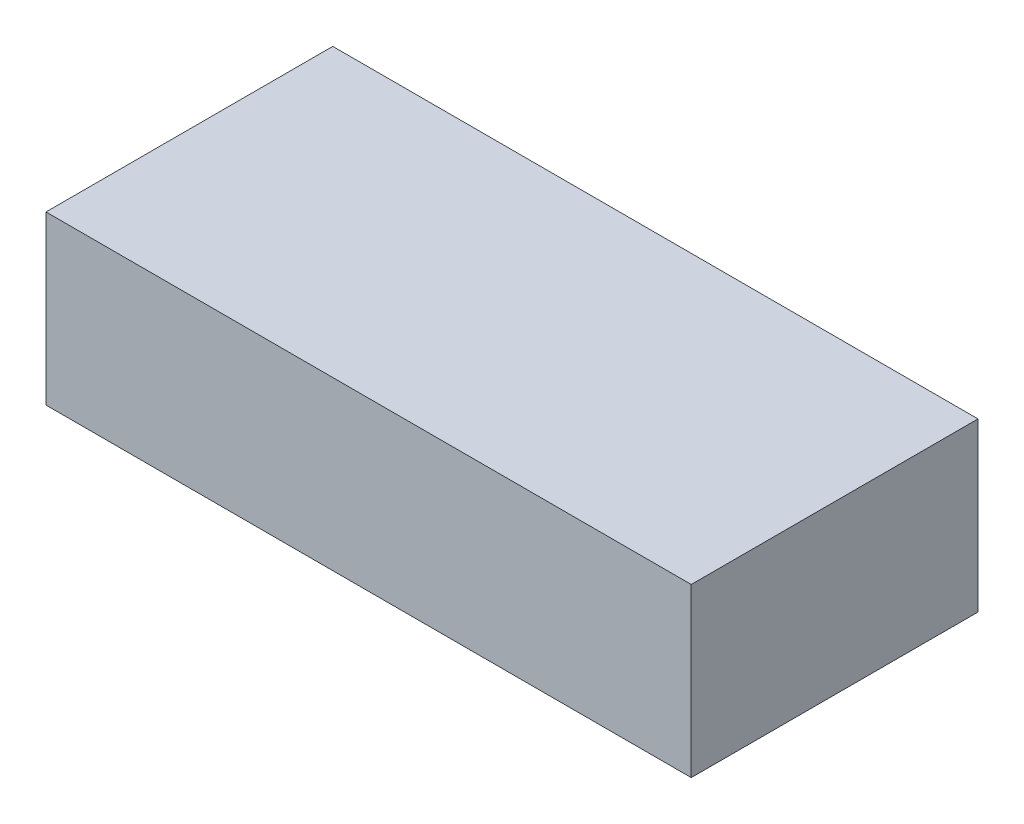
ISO-10303-21;
HEADER;
FILE_DESCRIPTION(('STEP AP214'),'2;1');
FILE_NAME('part.step','',(''),(''),'','','');
FILE_SCHEMA(('AUTOMOTIVE_DESIGN { 1 0 10303 214 1 1 1 1 }'));
ENDSEC;
DATA;
#1=APPLICATION_CONTEXT('core data for automotive mechanical design processes');
#2=APPLICATION_PROTOCOL_DEFINITION('international standard','automotive_design',2000,#1);
#3=PRODUCT_CONTEXT('',#1,'mechanical');
#4=PRODUCT('Part','Part','',(#3));
#5=PRODUCT_RELATED_PRODUCT_CATEGORY('part','',(#4));
#6=PRODUCT_DEFINITION_FORMATION('','',#4);
#7=PRODUCT_DEFINITION_CONTEXT('part definition',#1,'design');
#8=PRODUCT_DEFINITION('design','',#6,#7);
#9=PRODUCT_DEFINITION_SHAPE('','',#8);
#10=(LENGTH_UNIT() NAMED_UNIT(*) SI_UNIT(.MILLI.,.METRE.));
#11=(NAMED_UNIT(*) PLANE_ANGLE_UNIT() SI_UNIT($,.RADIAN.));
#12=(NAMED_UNIT(*) SI_UNIT($,.STERADIAN.) SOLID_ANGLE_UNIT());
#13=UNCERTAINTY_MEASURE_WITH_UNIT(LENGTH_MEASURE(1.E-05),#10,'distance_accuracy_value','');
#14=(GEOMETRIC_REPRESENTATION_CONTEXT(3) GLOBAL_UNCERTAINTY_ASSIGNED_CONTEXT((#13)) GLOBAL_UNIT_ASSIGNED_CONTEXT((#10,
#11,#12)) REPRESENTATION_CONTEXT('',''));
#15=CARTESIAN_POINT('',(0.,0.,0.));
#16=DIRECTION('',(0.,0.,1.));
#17=DIRECTION('',(1.,0.,0.));
#18=AXIS2_PLACEMENT_3D('',#15,#16,#17);
#19=CARTESIAN_POINT('',(-89.9595323741007,70.,32.2931654676259));
#20=DIRECTION('',(-1.,0.,0.));
#21=DIRECTION('',(0.,0.,1.));
#22=AXIS2_PLACEMENT_3D('',#19,#20,#21);
#23=PLANE('',#22);
#24=DIRECTION('',(0.,0.,-1.));
#25=VECTOR('',#24,1.);
#26=CARTESIAN_POINT('',(-89.9595323741007,0.,32.2931654676259));
#27=LINE('',#26,#25);
#28=CARTESIAN_POINT('',(-89.9595323741007,0.,32.2931654676259));
#29=VERTEX_POINT('',#28);
#30=CARTESIAN_POINT('',(-89.9595323741007,0.,-87.7068345323741));
#31=VERTEX_POINT('',#30);
#32=EDGE_CURVE('E106',#29,#31,#27,.T.);
#33=ORIENTED_EDGE('',*,*,#32,.F.);
#34=DIRECTION('',(0.,-1.,0.));
#35=VECTOR('',#34,1.);
#36=CARTESIAN_POINT('',(-89.9595323741007,70.,32.2931654676259));
#37=LINE('',#36,#35);
#38=CARTESIAN_POINT('',(-89.9595323741007,70.,32.2931654676259));
#39=VERTEX_POINT('',#38);
#40=EDGE_CURVE('E11',#39,#29,#37,.T.);
#41=ORIENTED_EDGE('',*,*,#40,.F.);
#42=DIRECTION('',(0.,0.,-1.));
#43=VECTOR('',#42,1.);
#44=CARTESIAN_POINT('',(-89.9595323741007,70.,32.2931654676259));
#45=LINE('',#44,#43);
#46=CARTESIAN_POINT('',(-89.9595323741007,70.,-87.7068345323741));
#47=VERTEX_POINT('',#46);
#48=EDGE_CURVE('E101',#39,#47,#45,.T.);
#49=ORIENTED_EDGE('',*,*,#48,.T.);
#50=DIRECTION('',(0.,-1.,0.));
#51=VECTOR('',#50,1.);
#52=CARTESIAN_POINT('',(-89.9595323741007,70.,-87.7068345323741));
#53=LINE('',#52,#51);
#54=EDGE_CURVE('E44',#47,#31,#53,.T.);
#55=ORIENTED_EDGE('',*,*,#54,.T.);
#56=EDGE_LOOP('',(#33,#41,#49,#55));
#57=FACE_BOUND('',#56,.T.);
#58=ADVANCED_FACE('F41',(#57),#23,.T.);
#59=CARTESIAN_POINT('',(-89.9595323741007,70.,32.2931654676259));
#60=DIRECTION('',(0.,0.,-1.));
#61=DIRECTION('',(-1.,0.,0.));
#62=AXIS2_PLACEMENT_3D('',#59,#60,#61);
#63=PLANE('',#62);
#64=DIRECTION('',(1.,0.,0.));
#65=VECTOR('',#64,1.);
#66=CARTESIAN_POINT('',(-89.9595323741007,0.,32.2931654676259));
#67=LINE('',#66,#65);
#68=CARTESIAN_POINT('',(180.040467625899,0.,32.2931654676259));
#69=VERTEX_POINT('',#68);
#70=EDGE_CURVE('E74',#29,#69,#67,.T.);
#71=ORIENTED_EDGE('',*,*,#70,.T.);
#72=DIRECTION('',(0.,-1.,0.));
#73=VECTOR('',#72,1.);
#74=CARTESIAN_POINT('',(180.040467625899,70.,32.2931654676259));
#75=LINE('',#74,#73);
#76=CARTESIAN_POINT('',(180.040467625899,70.,32.2931654676259));
#77=VERTEX_POINT('',#76);
#78=EDGE_CURVE('E50',#77,#69,#75,.T.);
#79=ORIENTED_EDGE('',*,*,#78,.F.);
#80=DIRECTION('',(1.,0.,0.));
#81=VECTOR('',#80,1.);
#82=CARTESIAN_POINT('',(-89.9595323741007,70.,32.2931654676259));
#83=LINE('',#82,#81);
#84=EDGE_CURVE('E91',#39,#77,#83,.T.);
#85=ORIENTED_EDGE('',*,*,#84,.F.);
#86=ORIENTED_EDGE('',*,*,#40,.T.);
#87=EDGE_LOOP('',(#71,#79,#85,#86));
#88=FACE_BOUND('',#87,.T.);
#89=ADVANCED_FACE('F116',(#88),#63,.F.);
#90=CARTESIAN_POINT('',(180.040467625899,70.,32.2931654676259));
#91=DIRECTION('',(-1.,0.,0.));
#92=DIRECTION('',(0.,0.,1.));
#93=AXIS2_PLACEMENT_3D('',#90,#91,#92);
#94=PLANE('',#93);
#95=DIRECTION('',(0.,0.,-1.));
#96=VECTOR('',#95,1.);
#97=CARTESIAN_POINT('',(180.040467625899,0.,32.2931654676259));
#98=LINE('',#97,#96);
#99=CARTESIAN_POINT('',(180.040467625899,0.,-87.7068345323741));
#100=VERTEX_POINT('',#99);
#101=EDGE_CURVE('E98',#69,#100,#98,.T.);
#102=ORIENTED_EDGE('',*,*,#101,.T.);
#103=DIRECTION('',(0.,-1.,0.));
#104=VECTOR('',#103,1.);
#105=CARTESIAN_POINT('',(180.040467625899,70.,-87.7068345323741));
#106=LINE('',#105,#104);
#107=CARTESIAN_POINT('',(180.040467625899,70.,-87.7068345323741));
#108=VERTEX_POINT('',#107);
#109=EDGE_CURVE('E95',#108,#100,#106,.T.);
#110=ORIENTED_EDGE('',*,*,#109,.F.);
#111=DIRECTION('',(0.,0.,-1.));
#112=VECTOR('',#111,1.);
#113=CARTESIAN_POINT('',(180.040467625899,70.,32.2931654676259));
#114=LINE('',#113,#112);
#115=EDGE_CURVE('E86',#77,#108,#114,.T.);
#116=ORIENTED_EDGE('',*,*,#115,.F.);
#117=ORIENTED_EDGE('',*,*,#78,.T.);
#118=EDGE_LOOP('',(#102,#110,#116,#117));
#119=FACE_BOUND('',#118,.T.);
#120=ADVANCED_FACE('F96',(#119),#94,.F.);
#121=CARTESIAN_POINT('',(-89.9595323741007,70.,-87.7068345323741));
#122=DIRECTION('',(0.,0.,-1.));
#123=DIRECTION('',(-1.,0.,0.));
#124=AXIS2_PLACEMENT_3D('',#121,#122,#123);
#125=PLANE('',#124);
#126=DIRECTION('',(1.,0.,0.));
#127=VECTOR('',#126,1.);
#128=CARTESIAN_POINT('',(-89.9595323741007,0.,-87.7068345323741));
#129=LINE('',#128,#127);
#130=EDGE_CURVE('E109',#31,#100,#129,.T.);
#131=ORIENTED_EDGE('',*,*,#130,.F.);
#132=ORIENTED_EDGE('',*,*,#54,.F.);
#133=DIRECTION('',(1.,0.,0.));
#134=VECTOR('',#133,1.);
#135=CARTESIAN_POINT('',(-89.9595323741007,70.,-87.7068345323741));
#136=LINE('',#135,#134);
#137=EDGE_CURVE('E90',#47,#108,#136,.T.);
#138=ORIENTED_EDGE('',*,*,#137,.T.);
#139=ORIENTED_EDGE('',*,*,#109,.T.);
#140=EDGE_LOOP('',(#131,#132,#138,#139));
#141=FACE_BOUND('',#140,.T.);
#142=ADVANCED_FACE('F100',(#141),#125,.T.);
#143=CARTESIAN_POINT('',(0.,70.,0.));
#144=DIRECTION('',(0.,-1.,0.));
#145=DIRECTION('',(0.,0.,-1.));
#146=AXIS2_PLACEMENT_3D('',#143,#144,#145);
#147=PLANE('',#146);
#148=ORIENTED_EDGE('',*,*,#48,.F.);
#149=ORIENTED_EDGE('',*,*,#84,.T.);
#150=ORIENTED_EDGE('',*,*,#115,.T.);
#151=ORIENTED_EDGE('',*,*,#137,.F.);
#152=EDGE_LOOP('',(#148,#149,#150,#151));
#153=FACE_BOUND('',#152,.T.);
#154=ADVANCED_FACE('F89',(#153),#147,.F.);
#155=CARTESIAN_POINT('',(0.,0.,0.));
#156=DIRECTION('',(0.,-1.,0.));
#157=DIRECTION('',(0.,0.,-1.));
#158=AXIS2_PLACEMENT_3D('',#155,#156,#157);
#159=PLANE('',#158);
#160=ORIENTED_EDGE('',*,*,#32,.T.);
#161=ORIENTED_EDGE('',*,*,#130,.T.);
#162=ORIENTED_EDGE('',*,*,#101,.F.);
#163=ORIENTED_EDGE('',*,*,#70,.F.);
#164=EDGE_LOOP('',(#160,#161,#162,#163));
#165=FACE_BOUND('',#164,.T.);
#166=ADVANCED_FACE('F114',(#165),#159,.T.);
#167=CLOSED_SHELL('',(#58,#89,#120,#142,#154,#166));
#168=MANIFOLD_SOLID_BREP('B2',#167);
#169=ADVANCED_BREP_SHAPE_REPRESENTATION('',(#18,#168),#14);
#170=SHAPE_DEFINITION_REPRESENTATION(#9,#169);
ENDSEC;
END-ISO-10303-21;
